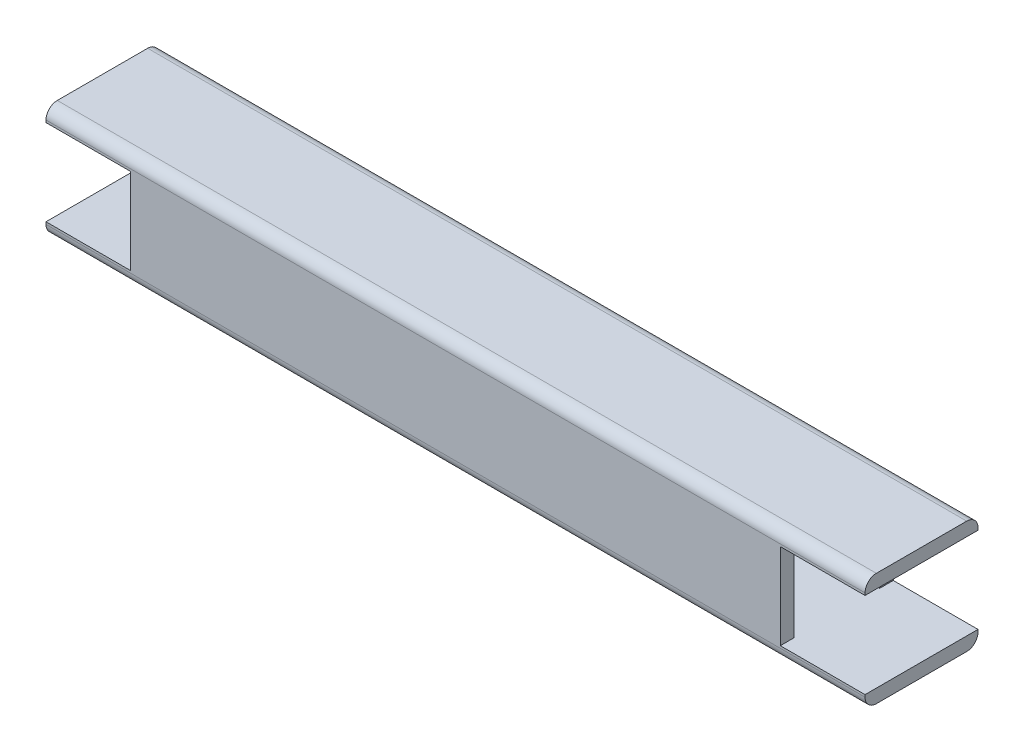
ISO-10303-21;
HEADER;
FILE_DESCRIPTION(('STEP AP214'),'2;1');
FILE_NAME('part.step','',(''),(''),'','','');
FILE_SCHEMA(('AUTOMOTIVE_DESIGN { 1 0 10303 214 1 1 1 1 }'));
ENDSEC;
DATA;
#1=APPLICATION_CONTEXT('core data for automotive mechanical design processes');
#2=APPLICATION_PROTOCOL_DEFINITION('international standard','automotive_design',2000,#1);
#3=PRODUCT_CONTEXT('',#1,'mechanical');
#4=PRODUCT('Part','Part','',(#3));
#5=PRODUCT_RELATED_PRODUCT_CATEGORY('part','',(#4));
#6=PRODUCT_DEFINITION_FORMATION('','',#4);
#7=PRODUCT_DEFINITION_CONTEXT('part definition',#1,'design');
#8=PRODUCT_DEFINITION('design','',#6,#7);
#9=PRODUCT_DEFINITION_SHAPE('','',#8);
#10=(LENGTH_UNIT() NAMED_UNIT(*) SI_UNIT(.MILLI.,.METRE.));
#11=(NAMED_UNIT(*) PLANE_ANGLE_UNIT() SI_UNIT($,.RADIAN.));
#12=(NAMED_UNIT(*) SI_UNIT($,.STERADIAN.) SOLID_ANGLE_UNIT());
#13=UNCERTAINTY_MEASURE_WITH_UNIT(LENGTH_MEASURE(1.E-05),#10,'distance_accuracy_value','');
#14=(GEOMETRIC_REPRESENTATION_CONTEXT(3) GLOBAL_UNCERTAINTY_ASSIGNED_CONTEXT((#13)) GLOBAL_UNIT_ASSIGNED_CONTEXT((#10,
#11,#12)) REPRESENTATION_CONTEXT('',''));
#15=CARTESIAN_POINT('',(0.,0.,0.));
#16=DIRECTION('',(0.,0.,1.));
#17=DIRECTION('',(1.,0.,0.));
#18=AXIS2_PLACEMENT_3D('',#15,#16,#17);
#19=CARTESIAN_POINT('',(184.15,3.048,3.048));
#20=DIRECTION('',(0.,0.,1.));
#21=DIRECTION('',(1.,0.,0.));
#22=AXIS2_PLACEMENT_3D('',#19,#20,#21);
#23=PLANE('',#22);
#24=DIRECTION('',(-1.,0.,0.));
#25=VECTOR('',#24,1.);
#26=CARTESIAN_POINT('',(184.15,22.352,3.048));
#27=LINE('',#26,#25);
#28=CARTESIAN_POINT('',(165.1,22.352,3.048));
#29=VERTEX_POINT('',#28);
#30=CARTESIAN_POINT('',(19.05,22.352,3.048));
#31=VERTEX_POINT('',#30);
#32=EDGE_CURVE('E257',#29,#31,#27,.T.);
#33=ORIENTED_EDGE('',*,*,#32,.T.);
#34=DIRECTION('',(0.,-1.,0.));
#35=VECTOR('',#34,1.);
#36=CARTESIAN_POINT('',(19.05,3.048,3.048));
#37=LINE('',#36,#35);
#38=CARTESIAN_POINT('',(19.05,3.048,3.048));
#39=VERTEX_POINT('',#38);
#40=EDGE_CURVE('E215',#31,#39,#37,.T.);
#41=ORIENTED_EDGE('',*,*,#40,.T.);
#42=DIRECTION('',(-1.,0.,0.));
#43=VECTOR('',#42,1.);
#44=CARTESIAN_POINT('',(184.15,3.048,3.048));
#45=LINE('',#44,#43);
#46=CARTESIAN_POINT('',(165.1,3.048,3.048));
#47=VERTEX_POINT('',#46);
#48=EDGE_CURVE('E189',#47,#39,#45,.T.);
#49=ORIENTED_EDGE('',*,*,#48,.F.);
#50=DIRECTION('',(0.,1.,0.));
#51=VECTOR('',#50,1.);
#52=CARTESIAN_POINT('',(165.1,3.048,3.048));
#53=LINE('',#52,#51);
#54=EDGE_CURVE('E232',#47,#29,#53,.T.);
#55=ORIENTED_EDGE('',*,*,#54,.T.);
#56=EDGE_LOOP('',(#33,#41,#49,#55));
#57=FACE_BOUND('',#56,.T.);
#58=ADVANCED_FACE('F43',(#57),#23,.T.);
#59=CARTESIAN_POINT('',(184.15,22.352,22.352));
#60=DIRECTION('',(0.,0.,-1.));
#61=DIRECTION('',(0.,1.,0.));
#62=AXIS2_PLACEMENT_3D('',#59,#60,#61);
#63=PLANE('',#62);
#64=DIRECTION('',(-1.,0.,0.));
#65=VECTOR('',#64,1.);
#66=CARTESIAN_POINT('',(184.15,3.048,22.352));
#67=LINE('',#66,#65);
#68=CARTESIAN_POINT('',(165.1,3.048,22.352));
#69=VERTEX_POINT('',#68);
#70=CARTESIAN_POINT('',(19.05,3.048,22.352));
#71=VERTEX_POINT('',#70);
#72=EDGE_CURVE('E249',#69,#71,#67,.T.);
#73=ORIENTED_EDGE('',*,*,#72,.T.);
#74=DIRECTION('',(0.,1.,0.));
#75=VECTOR('',#74,1.);
#76=CARTESIAN_POINT('',(19.05,22.352,22.352));
#77=LINE('',#76,#75);
#78=CARTESIAN_POINT('',(19.05,22.352,22.352));
#79=VERTEX_POINT('',#78);
#80=EDGE_CURVE('E212',#71,#79,#77,.T.);
#81=ORIENTED_EDGE('',*,*,#80,.T.);
#82=DIRECTION('',(-1.,0.,0.));
#83=VECTOR('',#82,1.);
#84=CARTESIAN_POINT('',(184.15,22.352,22.352));
#85=LINE('',#84,#83);
#86=CARTESIAN_POINT('',(165.1,22.352,22.352));
#87=VERTEX_POINT('',#86);
#88=EDGE_CURVE('E254',#87,#79,#85,.T.);
#89=ORIENTED_EDGE('',*,*,#88,.F.);
#90=DIRECTION('',(0.,-1.,0.));
#91=VECTOR('',#90,1.);
#92=CARTESIAN_POINT('',(165.1,22.352,22.352));
#93=LINE('',#92,#91);
#94=EDGE_CURVE('E11',#87,#69,#93,.T.);
#95=ORIENTED_EDGE('',*,*,#94,.T.);
#96=EDGE_LOOP('',(#73,#81,#89,#95));
#97=FACE_BOUND('',#96,.T.);
#98=ADVANCED_FACE('F381',(#97),#63,.T.);
#99=CARTESIAN_POINT('',(0.,2.54,22.86));
#100=DIRECTION('',(1.,0.,0.));
#101=DIRECTION('',(0.,0.,-1.));
#102=AXIS2_PLACEMENT_3D('',#99,#100,#101);
#103=PLANE('',#102);
#104=DIRECTION('',(0.,1.,0.));
#105=VECTOR('',#104,1.);
#106=CARTESIAN_POINT('',(0.,2.54000000000002,0.));
#107=LINE('',#106,#105);
#108=CARTESIAN_POINT('',(0.,22.352,0.));
#109=VERTEX_POINT('',#108);
#110=CARTESIAN_POINT('',(0.,22.86,0.));
#111=VERTEX_POINT('',#110);
#112=EDGE_CURVE('E291',#109,#111,#107,.T.);
#113=ORIENTED_EDGE('',*,*,#112,.F.);
#114=DIRECTION('',(0.,0.,1.));
#115=VECTOR('',#114,1.);
#116=CARTESIAN_POINT('',(0.,22.352,3.048));
#117=LINE('',#116,#115);
#118=CARTESIAN_POINT('',(0.,22.352,25.4));
#119=VERTEX_POINT('',#118);
#120=EDGE_CURVE('E247',#109,#119,#117,.T.);
#121=ORIENTED_EDGE('',*,*,#120,.T.);
#122=DIRECTION('',(0.,-1.,0.));
#123=VECTOR('',#122,1.);
#124=CARTESIAN_POINT('',(0.,22.86,25.4));
#125=LINE('',#124,#123);
#126=CARTESIAN_POINT('',(0.,22.86,25.4));
#127=VERTEX_POINT('',#126);
#128=EDGE_CURVE('E266',#127,#119,#125,.T.);
#129=ORIENTED_EDGE('',*,*,#128,.F.);
#130=CARTESIAN_POINT('',(0.,22.86,22.86));
#131=DIRECTION('',(1.,0.,0.));
#132=DIRECTION('',(0.,0.,1.));
#133=AXIS2_PLACEMENT_3D('',#130,#131,#132);
#134=CIRCLE('',#133,2.54);
#135=CARTESIAN_POINT('',(0.,25.4,22.86));
#136=VERTEX_POINT('',#135);
#137=EDGE_CURVE('E297',#136,#127,#134,.T.);
#138=ORIENTED_EDGE('',*,*,#137,.F.);
#139=DIRECTION('',(0.,0.,1.));
#140=VECTOR('',#139,1.);
#141=CARTESIAN_POINT('',(0.,25.4,2.54));
#142=LINE('',#141,#140);
#143=CARTESIAN_POINT('',(0.,25.4,2.54));
#144=VERTEX_POINT('',#143);
#145=EDGE_CURVE('E295',#144,#136,#142,.T.);
#146=ORIENTED_EDGE('',*,*,#145,.F.);
#147=CARTESIAN_POINT('',(0.,22.86,2.54));
#148=DIRECTION('',(1.,0.,0.));
#149=DIRECTION('',(0.,0.,-1.));
#150=AXIS2_PLACEMENT_3D('',#147,#148,#149);
#151=CIRCLE('',#150,2.54);
#152=EDGE_CURVE('E293',#111,#144,#151,.T.);
#153=ORIENTED_EDGE('',*,*,#152,.F.);
#154=EDGE_LOOP('',(#113,#121,#129,#138,#146,#153));
#155=FACE_BOUND('',#154,.T.);
#156=ADVANCED_FACE('F360',(#155),#103,.F.);
#157=CARTESIAN_POINT('',(184.15,2.54,22.86));
#158=DIRECTION('',(1.,0.,0.));
#159=DIRECTION('',(0.,0.,-1.));
#160=AXIS2_PLACEMENT_3D('',#157,#158,#159);
#161=PLANE('',#160);
#162=DIRECTION('',(0.,0.,1.));
#163=VECTOR('',#162,1.);
#164=CARTESIAN_POINT('',(184.15,22.352,3.048));
#165=LINE('',#164,#163);
#166=CARTESIAN_POINT('',(184.15,22.352,0.));
#167=VERTEX_POINT('',#166);
#168=CARTESIAN_POINT('',(184.15,22.352,25.4));
#169=VERTEX_POINT('',#168);
#170=EDGE_CURVE('E246',#167,#169,#165,.T.);
#171=ORIENTED_EDGE('',*,*,#170,.F.);
#172=DIRECTION('',(0.,1.,0.));
#173=VECTOR('',#172,1.);
#174=CARTESIAN_POINT('',(184.15,2.54000000000002,0.));
#175=LINE('',#174,#173);
#176=CARTESIAN_POINT('',(184.15,22.86,0.));
#177=VERTEX_POINT('',#176);
#178=EDGE_CURVE('E270',#167,#177,#175,.T.);
#179=ORIENTED_EDGE('',*,*,#178,.T.);
#180=CARTESIAN_POINT('',(184.15,22.86,2.54));
#181=DIRECTION('',(1.,0.,0.));
#182=DIRECTION('',(0.,0.,-1.));
#183=AXIS2_PLACEMENT_3D('',#180,#181,#182);
#184=CIRCLE('',#183,2.54);
#185=CARTESIAN_POINT('',(184.15,25.4,2.54));
#186=VERTEX_POINT('',#185);
#187=EDGE_CURVE('E274',#177,#186,#184,.T.);
#188=ORIENTED_EDGE('',*,*,#187,.T.);
#189=DIRECTION('',(0.,0.,1.));
#190=VECTOR('',#189,1.);
#191=CARTESIAN_POINT('',(184.15,25.4,2.54));
#192=LINE('',#191,#190);
#193=CARTESIAN_POINT('',(184.15,25.4,22.86));
#194=VERTEX_POINT('',#193);
#195=EDGE_CURVE('E276',#186,#194,#192,.T.);
#196=ORIENTED_EDGE('',*,*,#195,.T.);
#197=CARTESIAN_POINT('',(184.15,22.86,22.86));
#198=DIRECTION('',(1.,0.,0.));
#199=DIRECTION('',(0.,0.,1.));
#200=AXIS2_PLACEMENT_3D('',#197,#198,#199);
#201=CIRCLE('',#200,2.54);
#202=CARTESIAN_POINT('',(184.15,22.86,25.4));
#203=VERTEX_POINT('',#202);
#204=EDGE_CURVE('E278',#194,#203,#201,.T.);
#205=ORIENTED_EDGE('',*,*,#204,.T.);
#206=DIRECTION('',(0.,-1.,0.));
#207=VECTOR('',#206,1.);
#208=CARTESIAN_POINT('',(184.15,22.86,25.4));
#209=LINE('',#208,#207);
#210=EDGE_CURVE('E281',#203,#169,#209,.T.);
#211=ORIENTED_EDGE('',*,*,#210,.T.);
#212=EDGE_LOOP('',(#171,#179,#188,#196,#205,#211));
#213=FACE_BOUND('',#212,.T.);
#214=ADVANCED_FACE('F371',(#213),#161,.T.);
#215=DIRECTION('',(0.,0.,-1.));
#216=VECTOR('',#215,1.);
#217=CARTESIAN_POINT('',(184.15,3.048,22.352));
#218=LINE('',#217,#216);
#219=CARTESIAN_POINT('',(184.15,3.048,25.4));
#220=VERTEX_POINT('',#219);
#221=CARTESIAN_POINT('',(184.15,3.048,0.));
#222=VERTEX_POINT('',#221);
#223=EDGE_CURVE('E244',#220,#222,#218,.T.);
#224=ORIENTED_EDGE('',*,*,#223,.F.);
#225=CARTESIAN_POINT('',(184.15,2.54,25.4));
#226=VERTEX_POINT('',#225);
#227=EDGE_CURVE('E280',#220,#226,#209,.T.);
#228=ORIENTED_EDGE('',*,*,#227,.T.);
#229=CARTESIAN_POINT('',(184.15,2.54,22.86));
#230=DIRECTION('',(1.,0.,0.));
#231=DIRECTION('',(0.,0.,-1.));
#232=AXIS2_PLACEMENT_3D('',#229,#230,#231);
#233=CIRCLE('',#232,2.54);
#234=CARTESIAN_POINT('',(184.15,0.,22.86));
#235=VERTEX_POINT('',#234);
#236=EDGE_CURVE('E262',#226,#235,#233,.T.);
#237=ORIENTED_EDGE('',*,*,#236,.T.);
#238=DIRECTION('',(0.,0.,-1.));
#239=VECTOR('',#238,1.);
#240=CARTESIAN_POINT('',(184.15,0.,22.86));
#241=LINE('',#240,#239);
#242=CARTESIAN_POINT('',(184.15,0.,2.54000000000002));
#243=VERTEX_POINT('',#242);
#244=EDGE_CURVE('E265',#235,#243,#241,.T.);
#245=ORIENTED_EDGE('',*,*,#244,.T.);
#246=CARTESIAN_POINT('',(184.15,2.54,2.54));
#247=DIRECTION('',(1.,0.,0.));
#248=DIRECTION('',(0.,0.,1.));
#249=AXIS2_PLACEMENT_3D('',#246,#247,#248);
#250=CIRCLE('',#249,2.54);
#251=CARTESIAN_POINT('',(184.15,2.54000000000002,0.));
#252=VERTEX_POINT('',#251);
#253=EDGE_CURVE('E268',#243,#252,#250,.T.);
#254=ORIENTED_EDGE('',*,*,#253,.T.);
#255=EDGE_CURVE('E271',#252,#222,#175,.T.);
#256=ORIENTED_EDGE('',*,*,#255,.T.);
#257=EDGE_LOOP('',(#224,#228,#237,#245,#254,#256));
#258=FACE_BOUND('',#257,.T.);
#259=ADVANCED_FACE('F341',(#258),#161,.T.);
#260=CARTESIAN_POINT('',(0.,3.048,25.4));
#261=VERTEX_POINT('',#260);
#262=CARTESIAN_POINT('',(0.,2.54,25.4));
#263=VERTEX_POINT('',#262);
#264=EDGE_CURVE('E299',#261,#263,#125,.T.);
#265=ORIENTED_EDGE('',*,*,#264,.F.);
#266=DIRECTION('',(0.,0.,-1.));
#267=VECTOR('',#266,1.);
#268=CARTESIAN_POINT('',(0.,3.048,22.352));
#269=LINE('',#268,#267);
#270=CARTESIAN_POINT('',(0.,3.048,0.));
#271=VERTEX_POINT('',#270);
#272=EDGE_CURVE('E243',#261,#271,#269,.T.);
#273=ORIENTED_EDGE('',*,*,#272,.T.);
#274=CARTESIAN_POINT('',(0.,2.54000000000002,0.));
#275=VERTEX_POINT('',#274);
#276=EDGE_CURVE('E204',#275,#271,#107,.T.);
#277=ORIENTED_EDGE('',*,*,#276,.F.);
#278=CARTESIAN_POINT('',(0.,2.54,2.54));
#279=DIRECTION('',(1.,0.,0.));
#280=DIRECTION('',(0.,0.,1.));
#281=AXIS2_PLACEMENT_3D('',#278,#279,#280);
#282=CIRCLE('',#281,2.54);
#283=CARTESIAN_POINT('',(0.,0.,2.54000000000002));
#284=VERTEX_POINT('',#283);
#285=EDGE_CURVE('E289',#284,#275,#282,.T.);
#286=ORIENTED_EDGE('',*,*,#285,.F.);
#287=DIRECTION('',(0.,0.,-1.));
#288=VECTOR('',#287,1.);
#289=CARTESIAN_POINT('',(0.,0.,22.86));
#290=LINE('',#289,#288);
#291=CARTESIAN_POINT('',(0.,0.,22.86));
#292=VERTEX_POINT('',#291);
#293=EDGE_CURVE('E287',#292,#284,#290,.T.);
#294=ORIENTED_EDGE('',*,*,#293,.F.);
#295=CARTESIAN_POINT('',(0.,2.54,22.86));
#296=DIRECTION('',(1.,0.,0.));
#297=DIRECTION('',(0.,0.,-1.));
#298=AXIS2_PLACEMENT_3D('',#295,#296,#297);
#299=CIRCLE('',#298,2.54);
#300=EDGE_CURVE('E261',#263,#292,#299,.T.);
#301=ORIENTED_EDGE('',*,*,#300,.F.);
#302=EDGE_LOOP('',(#265,#273,#277,#286,#294,#301));
#303=FACE_BOUND('',#302,.T.);
#304=ADVANCED_FACE('F331',(#303),#103,.F.);
#305=CARTESIAN_POINT('',(184.15,2.54,22.86));
#306=DIRECTION('',(-1.,0.,0.));
#307=DIRECTION('',(0.,0.,1.));
#308=AXIS2_PLACEMENT_3D('',#305,#306,#307);
#309=CYLINDRICAL_SURFACE('',#308,2.54);
#310=ORIENTED_EDGE('',*,*,#300,.T.);
#311=DIRECTION('',(-1.,0.,0.));
#312=VECTOR('',#311,1.);
#313=CARTESIAN_POINT('',(184.15,0.,22.86));
#314=LINE('',#313,#312);
#315=EDGE_CURVE('E51',#235,#292,#314,.T.);
#316=ORIENTED_EDGE('',*,*,#315,.F.);
#317=ORIENTED_EDGE('',*,*,#236,.F.);
#318=DIRECTION('',(-1.,0.,0.));
#319=VECTOR('',#318,1.);
#320=CARTESIAN_POINT('',(184.15,2.54,25.4));
#321=LINE('',#320,#319);
#322=EDGE_CURVE('E284',#226,#263,#321,.T.);
#323=ORIENTED_EDGE('',*,*,#322,.T.);
#324=EDGE_LOOP('',(#310,#316,#317,#323));
#325=FACE_BOUND('',#324,.T.);
#326=ADVANCED_FACE('F45',(#325),#309,.T.);
#327=CARTESIAN_POINT('',(184.15,0.,22.86));
#328=DIRECTION('',(0.,1.,0.));
#329=DIRECTION('',(0.,0.,1.));
#330=AXIS2_PLACEMENT_3D('',#327,#328,#329);
#331=PLANE('',#330);
#332=ORIENTED_EDGE('',*,*,#293,.T.);
#333=DIRECTION('',(-1.,0.,0.));
#334=VECTOR('',#333,1.);
#335=CARTESIAN_POINT('',(184.15,0.,2.54000000000002));
#336=LINE('',#335,#334);
#337=EDGE_CURVE('E318',#243,#284,#336,.T.);
#338=ORIENTED_EDGE('',*,*,#337,.F.);
#339=ORIENTED_EDGE('',*,*,#244,.F.);
#340=ORIENTED_EDGE('',*,*,#315,.T.);
#341=EDGE_LOOP('',(#332,#338,#339,#340));
#342=FACE_BOUND('',#341,.T.);
#343=ADVANCED_FACE('F323',(#342),#331,.F.);
#344=CARTESIAN_POINT('',(184.15,2.54,2.54));
#345=DIRECTION('',(-1.,0.,0.));
#346=DIRECTION('',(0.,0.,1.));
#347=AXIS2_PLACEMENT_3D('',#344,#345,#346);
#348=CYLINDRICAL_SURFACE('',#347,2.54);
#349=ORIENTED_EDGE('',*,*,#285,.T.);
#350=DIRECTION('',(-1.,0.,0.));
#351=VECTOR('',#350,1.);
#352=CARTESIAN_POINT('',(184.15,2.54000000000002,0.));
#353=LINE('',#352,#351);
#354=EDGE_CURVE('E316',#252,#275,#353,.T.);
#355=ORIENTED_EDGE('',*,*,#354,.F.);
#356=ORIENTED_EDGE('',*,*,#253,.F.);
#357=ORIENTED_EDGE('',*,*,#337,.T.);
#358=EDGE_LOOP('',(#349,#355,#356,#357));
#359=FACE_BOUND('',#358,.T.);
#360=ADVANCED_FACE('F335',(#359),#348,.T.);
#361=CARTESIAN_POINT('',(184.15,2.54000000000002,0.));
#362=DIRECTION('',(0.,0.,1.));
#363=DIRECTION('',(1.,0.,0.));
#364=AXIS2_PLACEMENT_3D('',#361,#362,#363);
#365=PLANE('',#364);
#366=DIRECTION('',(0.,-1.,0.));
#367=VECTOR('',#366,1.);
#368=CARTESIAN_POINT('',(19.05,22.352,0.));
#369=LINE('',#368,#367);
#370=CARTESIAN_POINT('',(19.05,22.352,0.));
#371=VERTEX_POINT('',#370);
#372=CARTESIAN_POINT('',(19.05,3.048,0.));
#373=VERTEX_POINT('',#372);
#374=EDGE_CURVE('E196',#371,#373,#369,.T.);
#375=ORIENTED_EDGE('',*,*,#374,.F.);
#376=DIRECTION('',(-1.,0.,0.));
#377=VECTOR('',#376,1.);
#378=CARTESIAN_POINT('',(19.05,22.352,0.));
#379=LINE('',#378,#377);
#380=EDGE_CURVE('E58',#371,#109,#379,.T.);
#381=ORIENTED_EDGE('',*,*,#380,.T.);
#382=ORIENTED_EDGE('',*,*,#112,.T.);
#383=DIRECTION('',(-1.,0.,0.));
#384=VECTOR('',#383,1.);
#385=CARTESIAN_POINT('',(184.15,22.86,0.));
#386=LINE('',#385,#384);
#387=EDGE_CURVE('E313',#177,#111,#386,.T.);
#388=ORIENTED_EDGE('',*,*,#387,.F.);
#389=ORIENTED_EDGE('',*,*,#178,.F.);
#390=DIRECTION('',(1.,0.,0.));
#391=VECTOR('',#390,1.);
#392=CARTESIAN_POINT('',(165.1,22.352,0.));
#393=LINE('',#392,#391);
#394=CARTESIAN_POINT('',(165.1,22.352,0.));
#395=VERTEX_POINT('',#394);
#396=EDGE_CURVE('E233',#395,#167,#393,.T.);
#397=ORIENTED_EDGE('',*,*,#396,.F.);
#398=DIRECTION('',(0.,1.,0.));
#399=VECTOR('',#398,1.);
#400=CARTESIAN_POINT('',(165.1,22.352,0.));
#401=LINE('',#400,#399);
#402=CARTESIAN_POINT('',(165.1,3.048,0.));
#403=VERTEX_POINT('',#402);
#404=EDGE_CURVE('E223',#403,#395,#401,.T.);
#405=ORIENTED_EDGE('',*,*,#404,.F.);
#406=DIRECTION('',(1.,0.,0.));
#407=VECTOR('',#406,1.);
#408=CARTESIAN_POINT('',(165.1,3.048,0.));
#409=LINE('',#408,#407);
#410=EDGE_CURVE('E236',#403,#222,#409,.T.);
#411=ORIENTED_EDGE('',*,*,#410,.T.);
#412=ORIENTED_EDGE('',*,*,#255,.F.);
#413=ORIENTED_EDGE('',*,*,#354,.T.);
#414=ORIENTED_EDGE('',*,*,#276,.T.);
#415=DIRECTION('',(-1.,0.,0.));
#416=VECTOR('',#415,1.);
#417=CARTESIAN_POINT('',(19.05,3.048,0.));
#418=LINE('',#417,#416);
#419=EDGE_CURVE('E185',#373,#271,#418,.T.);
#420=ORIENTED_EDGE('',*,*,#419,.F.);
#421=EDGE_LOOP('',(#375,#381,#382,#388,#389,#397,#405,#411,#412,#413,#414,#420));
#422=FACE_BOUND('',#421,.T.);
#423=ADVANCED_FACE('F201',(#422),#365,.F.);
#424=CARTESIAN_POINT('',(184.15,22.86,2.54));
#425=DIRECTION('',(-1.,0.,0.));
#426=DIRECTION('',(0.,0.,1.));
#427=AXIS2_PLACEMENT_3D('',#424,#425,#426);
#428=CYLINDRICAL_SURFACE('',#427,2.54);
#429=ORIENTED_EDGE('',*,*,#152,.T.);
#430=DIRECTION('',(-1.,0.,0.));
#431=VECTOR('',#430,1.);
#432=CARTESIAN_POINT('',(184.15,25.4,2.54));
#433=LINE('',#432,#431);
#434=EDGE_CURVE('E310',#186,#144,#433,.T.);
#435=ORIENTED_EDGE('',*,*,#434,.F.);
#436=ORIENTED_EDGE('',*,*,#187,.F.);
#437=ORIENTED_EDGE('',*,*,#387,.T.);
#438=EDGE_LOOP('',(#429,#435,#436,#437));
#439=FACE_BOUND('',#438,.T.);
#440=ADVANCED_FACE('F367',(#439),#428,.T.);
#441=CARTESIAN_POINT('',(184.15,25.4,2.54));
#442=DIRECTION('',(0.,-1.,0.));
#443=DIRECTION('',(0.,0.,-1.));
#444=AXIS2_PLACEMENT_3D('',#441,#442,#443);
#445=PLANE('',#444);
#446=ORIENTED_EDGE('',*,*,#145,.T.);
#447=DIRECTION('',(-1.,0.,0.));
#448=VECTOR('',#447,1.);
#449=CARTESIAN_POINT('',(184.15,25.4,22.86));
#450=LINE('',#449,#448);
#451=EDGE_CURVE('E307',#194,#136,#450,.T.);
#452=ORIENTED_EDGE('',*,*,#451,.F.);
#453=ORIENTED_EDGE('',*,*,#195,.F.);
#454=ORIENTED_EDGE('',*,*,#434,.T.);
#455=EDGE_LOOP('',(#446,#452,#453,#454));
#456=FACE_BOUND('',#455,.T.);
#457=ADVANCED_FACE('F402',(#456),#445,.F.);
#458=CARTESIAN_POINT('',(184.15,22.86,22.86));
#459=DIRECTION('',(-1.,0.,0.));
#460=DIRECTION('',(0.,0.,1.));
#461=AXIS2_PLACEMENT_3D('',#458,#459,#460);
#462=CYLINDRICAL_SURFACE('',#461,2.54);
#463=ORIENTED_EDGE('',*,*,#137,.T.);
#464=DIRECTION('',(-1.,0.,0.));
#465=VECTOR('',#464,1.);
#466=CARTESIAN_POINT('',(184.15,22.86,25.4));
#467=LINE('',#466,#465);
#468=EDGE_CURVE('E304',#203,#127,#467,.T.);
#469=ORIENTED_EDGE('',*,*,#468,.F.);
#470=ORIENTED_EDGE('',*,*,#204,.F.);
#471=ORIENTED_EDGE('',*,*,#451,.T.);
#472=EDGE_LOOP('',(#463,#469,#470,#471));
#473=FACE_BOUND('',#472,.T.);
#474=ADVANCED_FACE('F399',(#473),#462,.T.);
#475=CARTESIAN_POINT('',(184.15,22.86,25.4));
#476=DIRECTION('',(0.,0.,-1.));
#477=DIRECTION('',(0.,1.,0.));
#478=AXIS2_PLACEMENT_3D('',#475,#476,#477);
#479=PLANE('',#478);
#480=ORIENTED_EDGE('',*,*,#128,.T.);
#481=DIRECTION('',(-1.,0.,0.));
#482=VECTOR('',#481,1.);
#483=CARTESIAN_POINT('',(19.05,22.352,25.4));
#484=LINE('',#483,#482);
#485=CARTESIAN_POINT('',(19.05,22.352,25.4));
#486=VERTEX_POINT('',#485);
#487=EDGE_CURVE('E207',#486,#119,#484,.T.);
#488=ORIENTED_EDGE('',*,*,#487,.F.);
#489=DIRECTION('',(0.,1.,0.));
#490=VECTOR('',#489,1.);
#491=CARTESIAN_POINT('',(19.05,22.352,25.4));
#492=LINE('',#491,#490);
#493=CARTESIAN_POINT('',(19.05,3.048,25.4));
#494=VERTEX_POINT('',#493);
#495=EDGE_CURVE('E192',#494,#486,#492,.T.);
#496=ORIENTED_EDGE('',*,*,#495,.F.);
#497=DIRECTION('',(-1.,0.,0.));
#498=VECTOR('',#497,1.);
#499=CARTESIAN_POINT('',(19.05,3.048,25.4));
#500=LINE('',#499,#498);
#501=EDGE_CURVE('E66',#494,#261,#500,.T.);
#502=ORIENTED_EDGE('',*,*,#501,.T.);
#503=ORIENTED_EDGE('',*,*,#264,.T.);
#504=ORIENTED_EDGE('',*,*,#322,.F.);
#505=ORIENTED_EDGE('',*,*,#227,.F.);
#506=DIRECTION('',(1.,0.,0.));
#507=VECTOR('',#506,1.);
#508=CARTESIAN_POINT('',(165.1,3.048,25.4));
#509=LINE('',#508,#507);
#510=CARTESIAN_POINT('',(165.1,3.048,25.4));
#511=VERTEX_POINT('',#510);
#512=EDGE_CURVE('E228',#511,#220,#509,.T.);
#513=ORIENTED_EDGE('',*,*,#512,.F.);
#514=DIRECTION('',(0.,-1.,0.));
#515=VECTOR('',#514,1.);
#516=CARTESIAN_POINT('',(165.1,22.352,25.4));
#517=LINE('',#516,#515);
#518=CARTESIAN_POINT('',(165.1,22.352,25.4));
#519=VERTEX_POINT('',#518);
#520=EDGE_CURVE('E217',#519,#511,#517,.T.);
#521=ORIENTED_EDGE('',*,*,#520,.F.);
#522=DIRECTION('',(1.,0.,0.));
#523=VECTOR('',#522,1.);
#524=CARTESIAN_POINT('',(165.1,22.352,25.4));
#525=LINE('',#524,#523);
#526=EDGE_CURVE('E229',#519,#169,#525,.T.);
#527=ORIENTED_EDGE('',*,*,#526,.T.);
#528=ORIENTED_EDGE('',*,*,#210,.F.);
#529=ORIENTED_EDGE('',*,*,#468,.T.);
#530=EDGE_LOOP('',(#480,#488,#496,#502,#503,#504,#505,#513,#521,#527,#528,#529));
#531=FACE_BOUND('',#530,.T.);
#532=ADVANCED_FACE('F345',(#531),#479,.F.);
#533=CARTESIAN_POINT('',(184.15,3.048,22.352));
#534=DIRECTION('',(0.,1.,0.));
#535=DIRECTION('',(0.,0.,1.));
#536=AXIS2_PLACEMENT_3D('',#533,#534,#535);
#537=PLANE('',#536);
#538=ORIENTED_EDGE('',*,*,#272,.F.);
#539=ORIENTED_EDGE('',*,*,#501,.F.);
#540=DIRECTION('',(0.,0.,1.));
#541=VECTOR('',#540,1.);
#542=CARTESIAN_POINT('',(19.05,3.048,0.));
#543=LINE('',#542,#541);
#544=EDGE_CURVE('E193',#71,#494,#543,.T.);
#545=ORIENTED_EDGE('',*,*,#544,.F.);
#546=ORIENTED_EDGE('',*,*,#72,.F.);
#547=DIRECTION('',(0.,0.,-1.));
#548=VECTOR('',#547,1.);
#549=CARTESIAN_POINT('',(165.1,3.048,25.4));
#550=LINE('',#549,#548);
#551=EDGE_CURVE('E221',#511,#69,#550,.T.);
#552=ORIENTED_EDGE('',*,*,#551,.F.);
#553=ORIENTED_EDGE('',*,*,#512,.T.);
#554=ORIENTED_EDGE('',*,*,#223,.T.);
#555=ORIENTED_EDGE('',*,*,#410,.F.);
#556=EDGE_CURVE('E220',#47,#403,#550,.T.);
#557=ORIENTED_EDGE('',*,*,#556,.F.);
#558=ORIENTED_EDGE('',*,*,#48,.T.);
#559=EDGE_CURVE('E181',#373,#39,#543,.T.);
#560=ORIENTED_EDGE('',*,*,#559,.F.);
#561=ORIENTED_EDGE('',*,*,#419,.T.);
#562=EDGE_LOOP('',(#538,#539,#545,#546,#552,#553,#554,#555,#557,#558,#560,#561));
#563=FACE_BOUND('',#562,.T.);
#564=ADVANCED_FACE('F183',(#563),#537,.T.);
#565=CARTESIAN_POINT('',(184.15,22.352,3.048));
#566=DIRECTION('',(0.,-1.,0.));
#567=DIRECTION('',(0.,0.,-1.));
#568=AXIS2_PLACEMENT_3D('',#565,#566,#567);
#569=PLANE('',#568);
#570=ORIENTED_EDGE('',*,*,#120,.F.);
#571=ORIENTED_EDGE('',*,*,#380,.F.);
#572=DIRECTION('',(0.,0.,-1.));
#573=VECTOR('',#572,1.);
#574=CARTESIAN_POINT('',(19.05,22.352,0.));
#575=LINE('',#574,#573);
#576=EDGE_CURVE('E198',#31,#371,#575,.T.);
#577=ORIENTED_EDGE('',*,*,#576,.F.);
#578=ORIENTED_EDGE('',*,*,#32,.F.);
#579=DIRECTION('',(0.,0.,1.));
#580=VECTOR('',#579,1.);
#581=CARTESIAN_POINT('',(165.1,22.352,25.4));
#582=LINE('',#581,#580);
#583=EDGE_CURVE('E226',#395,#29,#582,.T.);
#584=ORIENTED_EDGE('',*,*,#583,.F.);
#585=ORIENTED_EDGE('',*,*,#396,.T.);
#586=ORIENTED_EDGE('',*,*,#170,.T.);
#587=ORIENTED_EDGE('',*,*,#526,.F.);
#588=EDGE_CURVE('E225',#87,#519,#582,.T.);
#589=ORIENTED_EDGE('',*,*,#588,.F.);
#590=ORIENTED_EDGE('',*,*,#88,.T.);
#591=EDGE_CURVE('E205',#486,#79,#575,.T.);
#592=ORIENTED_EDGE('',*,*,#591,.F.);
#593=ORIENTED_EDGE('',*,*,#487,.T.);
#594=EDGE_LOOP('',(#570,#571,#577,#578,#584,#585,#586,#587,#589,#590,#592,#593));
#595=FACE_BOUND('',#594,.T.);
#596=ADVANCED_FACE('F353',(#595),#569,.T.);
#597=CARTESIAN_POINT('',(165.1,0.,0.));
#598=DIRECTION('',(1.,0.,0.));
#599=DIRECTION('',(0.,0.,-1.));
#600=AXIS2_PLACEMENT_3D('',#597,#598,#599);
#601=PLANE('',#600);
#602=ORIENTED_EDGE('',*,*,#588,.T.);
#603=ORIENTED_EDGE('',*,*,#520,.T.);
#604=ORIENTED_EDGE('',*,*,#551,.T.);
#605=ORIENTED_EDGE('',*,*,#94,.F.);
#606=EDGE_LOOP('',(#602,#603,#604,#605));
#607=FACE_BOUND('',#606,.T.);
#608=ADVANCED_FACE('F484',(#607),#601,.T.);
#609=ORIENTED_EDGE('',*,*,#556,.T.);
#610=ORIENTED_EDGE('',*,*,#404,.T.);
#611=ORIENTED_EDGE('',*,*,#583,.T.);
#612=ORIENTED_EDGE('',*,*,#54,.F.);
#613=EDGE_LOOP('',(#609,#610,#611,#612));
#614=FACE_BOUND('',#613,.T.);
#615=ADVANCED_FACE('F378',(#614),#601,.T.);
#616=CARTESIAN_POINT('',(19.05,0.,0.));
#617=DIRECTION('',(-1.,0.,0.));
#618=DIRECTION('',(0.,0.,1.));
#619=AXIS2_PLACEMENT_3D('',#616,#617,#618);
#620=PLANE('',#619);
#621=ORIENTED_EDGE('',*,*,#544,.T.);
#622=ORIENTED_EDGE('',*,*,#495,.T.);
#623=ORIENTED_EDGE('',*,*,#591,.T.);
#624=ORIENTED_EDGE('',*,*,#80,.F.);
#625=EDGE_LOOP('',(#621,#622,#623,#624));
#626=FACE_BOUND('',#625,.T.);
#627=ADVANCED_FACE('F506',(#626),#620,.T.);
#628=ORIENTED_EDGE('',*,*,#576,.T.);
#629=ORIENTED_EDGE('',*,*,#374,.T.);
#630=ORIENTED_EDGE('',*,*,#559,.T.);
#631=ORIENTED_EDGE('',*,*,#40,.F.);
#632=EDGE_LOOP('',(#628,#629,#630,#631));
#633=FACE_BOUND('',#632,.T.);
#634=ADVANCED_FACE('F197',(#633),#620,.T.);
#635=CLOSED_SHELL('',(#58,#98,#156,#214,#259,#304,#326,#343,#360,#423,#440,#457,#474,#532,#564,
#596,#608,#615,#627,#634));
#636=MANIFOLD_SOLID_BREP('B2',#635);
#637=ADVANCED_BREP_SHAPE_REPRESENTATION('',(#18,#636),#14);
#638=SHAPE_DEFINITION_REPRESENTATION(#9,#637);
ENDSEC;
END-ISO-10303-21;
